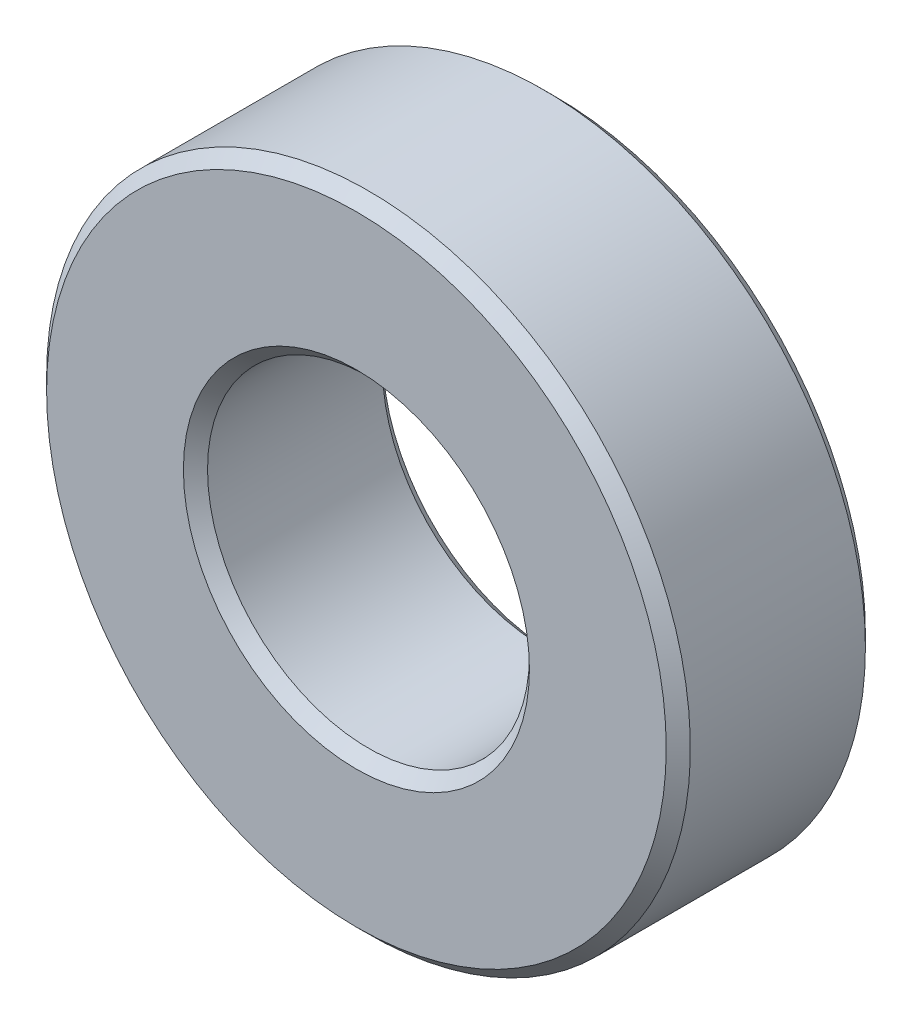
ISO-10303-21;
HEADER;
FILE_DESCRIPTION(('STEP AP214'),'2;1');
FILE_NAME('part.step','',(''),(''),'','','');
FILE_SCHEMA(('AUTOMOTIVE_DESIGN { 1 0 10303 214 1 1 1 1 }'));
ENDSEC;
DATA;
#1=APPLICATION_CONTEXT('core data for automotive mechanical design processes');
#2=APPLICATION_PROTOCOL_DEFINITION('international standard','automotive_design',2000,#1);
#3=PRODUCT_CONTEXT('',#1,'mechanical');
#4=PRODUCT('Part','Part','',(#3));
#5=PRODUCT_RELATED_PRODUCT_CATEGORY('part','',(#4));
#6=PRODUCT_DEFINITION_FORMATION('','',#4);
#7=PRODUCT_DEFINITION_CONTEXT('part definition',#1,'design');
#8=PRODUCT_DEFINITION('design','',#6,#7);
#9=PRODUCT_DEFINITION_SHAPE('','',#8);
#10=(LENGTH_UNIT() NAMED_UNIT(*) SI_UNIT(.MILLI.,.METRE.));
#11=(NAMED_UNIT(*) PLANE_ANGLE_UNIT() SI_UNIT($,.RADIAN.));
#12=(NAMED_UNIT(*) SI_UNIT($,.STERADIAN.) SOLID_ANGLE_UNIT());
#13=UNCERTAINTY_MEASURE_WITH_UNIT(LENGTH_MEASURE(1.E-05),#10,'distance_accuracy_value','');
#14=(GEOMETRIC_REPRESENTATION_CONTEXT(3) GLOBAL_UNCERTAINTY_ASSIGNED_CONTEXT((#13)) GLOBAL_UNIT_ASSIGNED_CONTEXT((#10,
#11,#12)) REPRESENTATION_CONTEXT('',''));
#15=CARTESIAN_POINT('',(0.,0.,0.));
#16=DIRECTION('',(0.,0.,1.));
#17=DIRECTION('',(1.,0.,0.));
#18=AXIS2_PLACEMENT_3D('',#15,#16,#17);
#19=CARTESIAN_POINT('',(0.,0.,4.95));
#20=DIRECTION('',(0.,0.,1.));
#21=DIRECTION('',(1.,0.,0.));
#22=AXIS2_PLACEMENT_3D('',#19,#20,#21);
#23=PLANE('',#22);
#24=CARTESIAN_POINT('',(0.,0.,4.95));
#25=DIRECTION('',(0.,0.,1.));
#26=DIRECTION('',(1.,0.,0.));
#27=AXIS2_PLACEMENT_3D('',#24,#25,#26);
#28=CIRCLE('',#27,4.30000000000001);
#29=CARTESIAN_POINT('',(4.30000000000001,0.,4.95));
#30=VERTEX_POINT('',#29);
#31=EDGE_CURVE('E10',#30,#30,#28,.F.);
#32=ORIENTED_EDGE('',*,*,#31,.T.);
#33=EDGE_LOOP('',(#32));
#34=FACE_BOUND('',#33,.T.);
#35=CARTESIAN_POINT('',(0.,0.,4.95));
#36=DIRECTION('',(0.,0.,1.));
#37=DIRECTION('',(1.,0.,0.));
#38=AXIS2_PLACEMENT_3D('',#35,#36,#37);
#39=CIRCLE('',#38,7.70000000000001);
#40=CARTESIAN_POINT('',(7.70000000000001,0.,4.95));
#41=VERTEX_POINT('',#40);
#42=EDGE_CURVE('E43',#41,#41,#39,.T.);
#43=ORIENTED_EDGE('',*,*,#42,.T.);
#44=EDGE_LOOP('',(#43));
#45=FACE_BOUND('',#44,.T.);
#46=ADVANCED_FACE('F36',(#34,#45),#23,.T.);
#47=CARTESIAN_POINT('',(0.,0.,0.));
#48=DIRECTION('',(0.,0.,1.));
#49=DIRECTION('',(1.,0.,0.));
#50=AXIS2_PLACEMENT_3D('',#47,#48,#49);
#51=PLANE('',#50);
#52=CARTESIAN_POINT('',(0.,0.,0.));
#53=DIRECTION('',(0.,0.,1.));
#54=DIRECTION('',(1.,0.,0.));
#55=AXIS2_PLACEMENT_3D('',#52,#53,#54);
#56=CIRCLE('',#55,4.29999999999999);
#57=CARTESIAN_POINT('',(4.29999999999999,0.,0.));
#58=VERTEX_POINT('',#57);
#59=EDGE_CURVE('E62',#58,#58,#56,.T.);
#60=ORIENTED_EDGE('',*,*,#59,.T.);
#61=EDGE_LOOP('',(#60));
#62=FACE_BOUND('',#61,.T.);
#63=CARTESIAN_POINT('',(0.,0.,0.));
#64=DIRECTION('',(0.,0.,1.));
#65=DIRECTION('',(1.,0.,0.));
#66=AXIS2_PLACEMENT_3D('',#63,#64,#65);
#67=CIRCLE('',#66,7.69999999999999);
#68=CARTESIAN_POINT('',(7.69999999999999,0.,0.));
#69=VERTEX_POINT('',#68);
#70=EDGE_CURVE('E65',#69,#69,#67,.F.);
#71=ORIENTED_EDGE('',*,*,#70,.T.);
#72=EDGE_LOOP('',(#71));
#73=FACE_BOUND('',#72,.T.);
#74=ADVANCED_FACE('F69',(#62,#73),#51,.F.);
#75=CARTESIAN_POINT('',(0.,0.,4.95));
#76=DIRECTION('',(0.,0.,-1.));
#77=DIRECTION('',(-1.,0.,0.));
#78=AXIS2_PLACEMENT_3D('',#75,#76,#77);
#79=CYLINDRICAL_SURFACE('',#78,8.);
#80=CARTESIAN_POINT('',(0.,0.,0.300000000000009));
#81=DIRECTION('',(0.,0.,1.));
#82=DIRECTION('',(1.,0.,0.));
#83=AXIS2_PLACEMENT_3D('',#80,#81,#82);
#84=CIRCLE('',#83,8.);
#85=CARTESIAN_POINT('',(-8.,0.,0.300000000000009));
#86=VERTEX_POINT('',#85);
#87=EDGE_CURVE('E47',#86,#86,#84,.T.);
#88=CARTESIAN_POINT('',(0.,0.,4.65000000000001));
#89=DIRECTION('',(0.,0.,1.));
#90=DIRECTION('',(1.,0.,0.));
#91=AXIS2_PLACEMENT_3D('',#88,#89,#90);
#92=CIRCLE('',#91,8.);
#93=CARTESIAN_POINT('',(-8.,0.,4.65000000000001));
#94=VERTEX_POINT('',#93);
#95=EDGE_CURVE('E51',#94,#94,#92,.F.);
#96=CARTESIAN_POINT('',(-8.,0.,0.300000000000009));
#97=CARTESIAN_POINT('',(-8.,0.,0.345312500000009));
#98=CARTESIAN_POINT('',(-8.,0.,0.390625000000008));
#99=CARTESIAN_POINT('',(-8.,0.,0.481250000000009));
#100=CARTESIAN_POINT('',(-8.,0.,0.526562500000009));
#101=CARTESIAN_POINT('',(-8.,0.,0.617187500000009));
#102=CARTESIAN_POINT('',(-8.,0.,0.662500000000009));
#103=CARTESIAN_POINT('',(-8.,0.,0.753125000000009));
#104=CARTESIAN_POINT('',(-8.,0.,0.798437500000009));
#105=CARTESIAN_POINT('',(-8.,0.,0.889062500000009));
#106=CARTESIAN_POINT('',(-8.,0.,0.934375000000009));
#107=CARTESIAN_POINT('',(-8.,0.,1.02500000000001));
#108=CARTESIAN_POINT('',(-8.,0.,1.07031250000001));
#109=CARTESIAN_POINT('',(-8.,0.,1.16093750000001));
#110=CARTESIAN_POINT('',(-8.,0.,1.20625000000001));
#111=CARTESIAN_POINT('',(-8.,0.,1.29687500000001));
#112=CARTESIAN_POINT('',(-8.,0.,1.34218750000001));
#113=CARTESIAN_POINT('',(-8.,0.,1.43281250000001));
#114=CARTESIAN_POINT('',(-8.,0.,1.47812500000001));
#115=CARTESIAN_POINT('',(-8.,0.,1.56875000000001));
#116=CARTESIAN_POINT('',(-8.,0.,1.61406250000001));
#117=CARTESIAN_POINT('',(-8.,0.,1.70468750000001));
#118=CARTESIAN_POINT('',(-8.,0.,1.75000000000001));
#119=CARTESIAN_POINT('',(-8.,0.,1.84062500000001));
#120=CARTESIAN_POINT('',(-8.,0.,1.88593750000001));
#121=CARTESIAN_POINT('',(-8.,0.,1.97656250000001));
#122=CARTESIAN_POINT('',(-8.,0.,2.02187500000001));
#123=CARTESIAN_POINT('',(-8.,0.,2.11250000000001));
#124=CARTESIAN_POINT('',(-8.,0.,2.15781250000001));
#125=CARTESIAN_POINT('',(-8.,0.,2.24843750000001));
#126=CARTESIAN_POINT('',(-8.,0.,2.29375000000001));
#127=CARTESIAN_POINT('',(-8.,0.,2.38437500000001));
#128=CARTESIAN_POINT('',(-8.,0.,2.42968750000001));
#129=CARTESIAN_POINT('',(-8.,0.,2.52031250000001));
#130=CARTESIAN_POINT('',(-8.,0.,2.56562500000001));
#131=CARTESIAN_POINT('',(-8.,0.,2.65625000000001));
#132=CARTESIAN_POINT('',(-8.,0.,2.70156250000001));
#133=CARTESIAN_POINT('',(-8.,0.,2.79218750000001));
#134=CARTESIAN_POINT('',(-8.,0.,2.83750000000001));
#135=CARTESIAN_POINT('',(-8.,0.,2.92812500000001));
#136=CARTESIAN_POINT('',(-8.,0.,2.97343750000001));
#137=CARTESIAN_POINT('',(-8.,0.,3.06406250000001));
#138=CARTESIAN_POINT('',(-8.,0.,3.10937500000001));
#139=CARTESIAN_POINT('',(-8.,0.,3.20000000000001));
#140=CARTESIAN_POINT('',(-8.,0.,3.24531250000001));
#141=CARTESIAN_POINT('',(-8.,0.,3.33593750000001));
#142=CARTESIAN_POINT('',(-8.,0.,3.38125000000001));
#143=CARTESIAN_POINT('',(-8.,0.,3.47187500000001));
#144=CARTESIAN_POINT('',(-8.,0.,3.51718750000001));
#145=CARTESIAN_POINT('',(-8.,0.,3.60781250000001));
#146=CARTESIAN_POINT('',(-8.,0.,3.65312500000001));
#147=CARTESIAN_POINT('',(-8.,0.,3.74375000000001));
#148=CARTESIAN_POINT('',(-8.,0.,3.78906250000001));
#149=CARTESIAN_POINT('',(-8.,0.,3.87968750000001));
#150=CARTESIAN_POINT('',(-8.,0.,3.92500000000001));
#151=CARTESIAN_POINT('',(-8.,0.,4.01562500000001));
#152=CARTESIAN_POINT('',(-8.,0.,4.06093750000001));
#153=CARTESIAN_POINT('',(-8.,0.,4.15156250000001));
#154=CARTESIAN_POINT('',(-8.,0.,4.19687500000001));
#155=CARTESIAN_POINT('',(-8.,0.,4.28750000000001));
#156=CARTESIAN_POINT('',(-8.,0.,4.33281250000001));
#157=CARTESIAN_POINT('',(-8.,0.,4.42343750000001));
#158=CARTESIAN_POINT('',(-8.,0.,4.46875000000001));
#159=CARTESIAN_POINT('',(-8.,0.,4.55937500000001));
#160=CARTESIAN_POINT('',(-8.,0.,4.60468750000001));
#161=CARTESIAN_POINT('',(-8.,0.,4.65000000000001));
#162=B_SPLINE_CURVE_WITH_KNOTS('',3,(#96,#97,#98,#99,#100,#101,#102,#103,#104,#105,#106,#107,
#108,#109,#110,#111,#112,#113,#114,#115,#116,#117,#118,#119,#120,#121,#122,#123,#124,#125,#126,
#127,#128,#129,#130,#131,#132,#133,#134,#135,#136,#137,#138,#139,#140,#141,#142,#143,#144,#145,
#146,#147,#148,#149,#150,#151,#152,#153,#154,#155,#156,#157,#158,#159,#160,#161),.UNSPECIFIED.,
.F.,.F.,(4,2,2,2,2,2,2,2,2,2,2,2,2,2,2,2,2,2,2,2,2,2,2,2,2,2,2,2,2,2,2,2,4),(0.,0.1359375,
0.271875,0.4078125,0.543750000000001,0.679687500000001,0.815625,0.951562500000001,1.0875,
1.2234375,1.359375,1.4953125,1.63125,1.7671875,1.903125,2.0390625,2.175,2.3109375,2.446875,
2.5828125,2.71875,2.8546875,2.990625,3.1265625,3.2625,3.3984375,3.534375,3.6703125,3.80625,
3.9421875,4.078125,4.2140625,4.35),.UNSPECIFIED.);
#163=EDGE_CURVE('BSEAM79',#86,#94,#162,.T.);
#164=ORIENTED_EDGE('',*,*,#87,.T.);
#165=ORIENTED_EDGE('',*,*,#95,.T.);
#166=ORIENTED_EDGE('',*,*,#163,.T.);
#167=ORIENTED_EDGE('',*,*,#163,.F.);
#168=EDGE_LOOP('',(#164,#166,#165,#167));
#169=FACE_BOUND('',#168,.T.);
#170=ADVANCED_FACE('F79',(#169),#79,.T.);
#171=CARTESIAN_POINT('',(0.,0.,4.95));
#172=DIRECTION('',(0.,0.,-1.));
#173=DIRECTION('',(-1.,0.,0.));
#174=AXIS2_PLACEMENT_3D('',#171,#172,#173);
#175=CYLINDRICAL_SURFACE('',#174,4.);
#176=CARTESIAN_POINT('',(0.,0.,0.299999999999996));
#177=DIRECTION('',(0.,0.,1.));
#178=DIRECTION('',(1.,0.,0.));
#179=AXIS2_PLACEMENT_3D('',#176,#177,#178);
#180=CIRCLE('',#179,4.);
#181=CARTESIAN_POINT('',(-4.,0.,0.299999999999995));
#182=VERTEX_POINT('',#181);
#183=EDGE_CURVE('E56',#182,#182,#180,.F.);
#184=CARTESIAN_POINT('',(0.,0.,4.64999999999999));
#185=DIRECTION('',(0.,0.,1.));
#186=DIRECTION('',(1.,0.,0.));
#187=AXIS2_PLACEMENT_3D('',#184,#185,#186);
#188=CIRCLE('',#187,4.);
#189=CARTESIAN_POINT('',(-4.,0.,4.64999999999999));
#190=VERTEX_POINT('',#189);
#191=EDGE_CURVE('E59',#190,#190,#188,.T.);
#192=CARTESIAN_POINT('',(-4.,0.,0.299999999999995));
#193=CARTESIAN_POINT('',(-4.,0.,0.345312499999995));
#194=CARTESIAN_POINT('',(-4.,0.,0.390624999999995));
#195=CARTESIAN_POINT('',(-4.,0.,0.481249999999994));
#196=CARTESIAN_POINT('',(-4.,0.,0.526562499999994));
#197=CARTESIAN_POINT('',(-4.,0.,0.617187499999994));
#198=CARTESIAN_POINT('',(-4.,0.,0.662499999999994));
#199=CARTESIAN_POINT('',(-4.,0.,0.753124999999994));
#200=CARTESIAN_POINT('',(-4.,0.,0.798437499999994));
#201=CARTESIAN_POINT('',(-4.,0.,0.889062499999994));
#202=CARTESIAN_POINT('',(-4.,0.,0.934374999999994));
#203=CARTESIAN_POINT('',(-4.,0.,1.02499999999999));
#204=CARTESIAN_POINT('',(-4.,0.,1.07031249999999));
#205=CARTESIAN_POINT('',(-4.,0.,1.16093749999999));
#206=CARTESIAN_POINT('',(-4.,0.,1.20624999999999));
#207=CARTESIAN_POINT('',(-4.,0.,1.29687499999999));
#208=CARTESIAN_POINT('',(-4.,0.,1.34218749999999));
#209=CARTESIAN_POINT('',(-4.,0.,1.43281249999999));
#210=CARTESIAN_POINT('',(-4.,0.,1.47812499999999));
#211=CARTESIAN_POINT('',(-4.,0.,1.56874999999999));
#212=CARTESIAN_POINT('',(-4.,0.,1.61406249999999));
#213=CARTESIAN_POINT('',(-4.,0.,1.70468749999999));
#214=CARTESIAN_POINT('',(-4.,0.,1.74999999999999));
#215=CARTESIAN_POINT('',(-4.,0.,1.84062499999999));
#216=CARTESIAN_POINT('',(-4.,0.,1.88593749999999));
#217=CARTESIAN_POINT('',(-4.,0.,1.97656249999999));
#218=CARTESIAN_POINT('',(-4.,0.,2.02187499999999));
#219=CARTESIAN_POINT('',(-4.,0.,2.11249999999999));
#220=CARTESIAN_POINT('',(-4.,0.,2.15781249999999));
#221=CARTESIAN_POINT('',(-4.,0.,2.24843749999999));
#222=CARTESIAN_POINT('',(-4.,0.,2.29374999999999));
#223=CARTESIAN_POINT('',(-4.,0.,2.38437499999999));
#224=CARTESIAN_POINT('',(-4.,0.,2.42968749999999));
#225=CARTESIAN_POINT('',(-4.,0.,2.52031249999999));
#226=CARTESIAN_POINT('',(-4.,0.,2.56562499999999));
#227=CARTESIAN_POINT('',(-4.,0.,2.65624999999999));
#228=CARTESIAN_POINT('',(-4.,0.,2.70156249999999));
#229=CARTESIAN_POINT('',(-4.,0.,2.79218749999999));
#230=CARTESIAN_POINT('',(-4.,0.,2.83749999999999));
#231=CARTESIAN_POINT('',(-4.,0.,2.92812499999999));
#232=CARTESIAN_POINT('',(-4.,0.,2.97343749999999));
#233=CARTESIAN_POINT('',(-4.,0.,3.06406249999999));
#234=CARTESIAN_POINT('',(-4.,0.,3.10937499999999));
#235=CARTESIAN_POINT('',(-4.,0.,3.19999999999999));
#236=CARTESIAN_POINT('',(-4.,0.,3.24531249999999));
#237=CARTESIAN_POINT('',(-4.,0.,3.33593749999999));
#238=CARTESIAN_POINT('',(-4.,0.,3.38124999999999));
#239=CARTESIAN_POINT('',(-4.,0.,3.47187499999999));
#240=CARTESIAN_POINT('',(-4.,0.,3.51718749999999));
#241=CARTESIAN_POINT('',(-4.,0.,3.60781249999999));
#242=CARTESIAN_POINT('',(-4.,0.,3.65312499999999));
#243=CARTESIAN_POINT('',(-4.,0.,3.74374999999999));
#244=CARTESIAN_POINT('',(-4.,0.,3.78906249999999));
#245=CARTESIAN_POINT('',(-4.,0.,3.87968749999999));
#246=CARTESIAN_POINT('',(-4.,0.,3.92499999999999));
#247=CARTESIAN_POINT('',(-4.,0.,4.01562499999999));
#248=CARTESIAN_POINT('',(-4.,0.,4.06093749999999));
#249=CARTESIAN_POINT('',(-4.,0.,4.15156249999999));
#250=CARTESIAN_POINT('',(-4.,0.,4.19687499999999));
#251=CARTESIAN_POINT('',(-4.,0.,4.28749999999999));
#252=CARTESIAN_POINT('',(-4.,0.,4.33281249999999));
#253=CARTESIAN_POINT('',(-4.,0.,4.42343749999999));
#254=CARTESIAN_POINT('',(-4.,0.,4.46874999999999));
#255=CARTESIAN_POINT('',(-4.,0.,4.55937499999999));
#256=CARTESIAN_POINT('',(-4.,0.,4.60468749999999));
#257=CARTESIAN_POINT('',(-4.,0.,4.64999999999999));
#258=B_SPLINE_CURVE_WITH_KNOTS('',3,(#192,#193,#194,#195,#196,#197,#198,#199,#200,#201,#202,
#203,#204,#205,#206,#207,#208,#209,#210,#211,#212,#213,#214,#215,#216,#217,#218,#219,#220,#221,
#222,#223,#224,#225,#226,#227,#228,#229,#230,#231,#232,#233,#234,#235,#236,#237,#238,#239,#240,
#241,#242,#243,#244,#245,#246,#247,#248,#249,#250,#251,#252,#253,#254,#255,#256,#257),
.UNSPECIFIED.,.F.,.F.,(4,2,2,2,2,2,2,2,2,2,2,2,2,2,2,2,2,2,2,2,2,2,2,2,2,2,2,2,2,2,2,2,4),(0.,
0.1359375,0.271875,0.407812499999999,0.543749999999999,0.679687499999999,0.815624999999998,
0.951562499999998,1.0875,1.2234375,1.359375,1.4953125,1.63125,1.7671875,1.903125,2.0390625,
2.175,2.3109375,2.446875,2.5828125,2.71874999999999,2.85468749999999,2.99062499999999,
3.12656249999999,3.26249999999999,3.39843749999999,3.53437499999999,3.67031249999999,
3.80624999999999,3.94218749999999,4.07812499999999,4.21406249999999,4.34999999999999),.UNSPECIFIED.);
#259=EDGE_CURVE('BSEAM82',#182,#190,#258,.T.);
#260=ORIENTED_EDGE('',*,*,#183,.T.);
#261=ORIENTED_EDGE('',*,*,#191,.T.);
#262=ORIENTED_EDGE('',*,*,#259,.T.);
#263=ORIENTED_EDGE('',*,*,#259,.F.);
#264=EDGE_LOOP('',(#260,#262,#261,#263));
#265=FACE_BOUND('',#264,.T.);
#266=ADVANCED_FACE('F82',(#265),#175,.F.);
#267=CARTESIAN_POINT('',(0.,0.,0.));
#268=DIRECTION('',(0.,0.,-1.));
#269=DIRECTION('',(-1.,0.,0.));
#270=AXIS2_PLACEMENT_3D('',#267,#268,#269);
#271=CONICAL_SURFACE('',#270,4.29999999999999,0.785398163397443);
#272=ORIENTED_EDGE('',*,*,#183,.F.);
#273=EDGE_LOOP('',(#272));
#274=FACE_BOUND('',#273,.T.);
#275=ORIENTED_EDGE('',*,*,#59,.F.);
#276=EDGE_LOOP('',(#275));
#277=FACE_BOUND('',#276,.T.);
#278=ADVANCED_FACE('F75',(#274,#277),#271,.F.);
#279=CARTESIAN_POINT('',(0.,0.,0.300000000000009));
#280=DIRECTION('',(0.,0.,1.));
#281=DIRECTION('',(1.,0.,0.));
#282=AXIS2_PLACEMENT_3D('',#279,#280,#281);
#283=CONICAL_SURFACE('',#282,8.,0.785398163397448);
#284=ORIENTED_EDGE('',*,*,#70,.F.);
#285=EDGE_LOOP('',(#284));
#286=FACE_BOUND('',#285,.T.);
#287=ORIENTED_EDGE('',*,*,#87,.F.);
#288=EDGE_LOOP('',(#287));
#289=FACE_BOUND('',#288,.T.);
#290=ADVANCED_FACE('F71',(#286,#289),#283,.T.);
#291=CARTESIAN_POINT('',(0.,0.,4.64999999999999));
#292=DIRECTION('',(0.,0.,1.));
#293=DIRECTION('',(1.,0.,0.));
#294=AXIS2_PLACEMENT_3D('',#291,#292,#293);
#295=CONICAL_SURFACE('',#294,4.,0.785398163397445);
#296=ORIENTED_EDGE('',*,*,#31,.F.);
#297=EDGE_LOOP('',(#296));
#298=FACE_BOUND('',#297,.T.);
#299=ORIENTED_EDGE('',*,*,#191,.F.);
#300=EDGE_LOOP('',(#299));
#301=FACE_BOUND('',#300,.T.);
#302=ADVANCED_FACE('F74',(#298,#301),#295,.F.);
#303=CARTESIAN_POINT('',(0.,0.,4.95));
#304=DIRECTION('',(0.,0.,-1.));
#305=DIRECTION('',(-1.,0.,0.));
#306=AXIS2_PLACEMENT_3D('',#303,#304,#305);
#307=CONICAL_SURFACE('',#306,7.70000000000001,0.785398163397448);
#308=ORIENTED_EDGE('',*,*,#95,.F.);
#309=EDGE_LOOP('',(#308));
#310=FACE_BOUND('',#309,.T.);
#311=ORIENTED_EDGE('',*,*,#42,.F.);
#312=EDGE_LOOP('',(#311));
#313=FACE_BOUND('',#312,.T.);
#314=ADVANCED_FACE('F38',(#310,#313),#307,.T.);
#315=CLOSED_SHELL('',(#46,#74,#170,#266,#278,#290,#302,#314));
#316=MANIFOLD_SOLID_BREP('B2',#315);
#317=ADVANCED_BREP_SHAPE_REPRESENTATION('',(#18,#316),#14);
#318=SHAPE_DEFINITION_REPRESENTATION(#9,#317);
ENDSEC;
END-ISO-10303-21;
